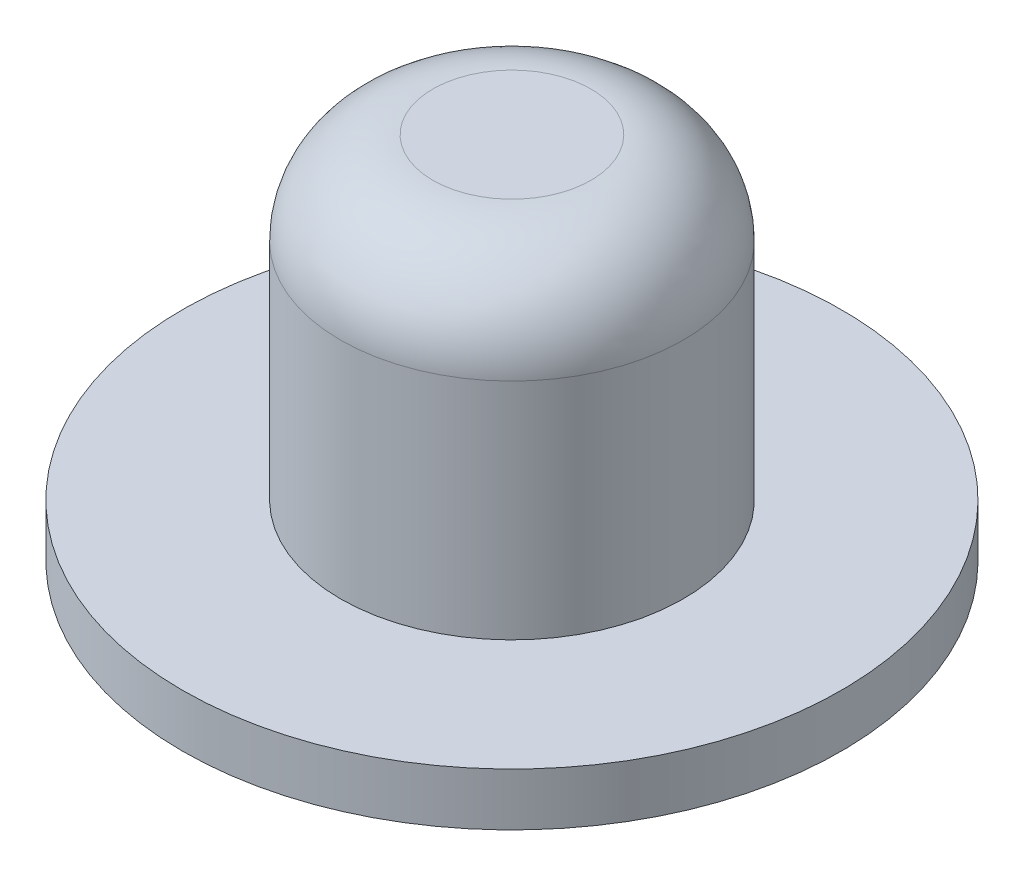
ISO-10303-21;
HEADER;
FILE_DESCRIPTION(('STEP AP214'),'2;1');
FILE_NAME('part.step','',(''),(''),'','','');
FILE_SCHEMA(('AUTOMOTIVE_DESIGN { 1 0 10303 214 1 1 1 1 }'));
ENDSEC;
DATA;
#1=APPLICATION_CONTEXT('core data for automotive mechanical design processes');
#2=APPLICATION_PROTOCOL_DEFINITION('international standard','automotive_design',2000,#1);
#3=PRODUCT_CONTEXT('',#1,'mechanical');
#4=PRODUCT('Part','Part','',(#3));
#5=PRODUCT_RELATED_PRODUCT_CATEGORY('part','',(#4));
#6=PRODUCT_DEFINITION_FORMATION('','',#4);
#7=PRODUCT_DEFINITION_CONTEXT('part definition',#1,'design');
#8=PRODUCT_DEFINITION('design','',#6,#7);
#9=PRODUCT_DEFINITION_SHAPE('','',#8);
#10=(LENGTH_UNIT() NAMED_UNIT(*) SI_UNIT(.MILLI.,.METRE.));
#11=(NAMED_UNIT(*) PLANE_ANGLE_UNIT() SI_UNIT($,.RADIAN.));
#12=(NAMED_UNIT(*) SI_UNIT($,.STERADIAN.) SOLID_ANGLE_UNIT());
#13=UNCERTAINTY_MEASURE_WITH_UNIT(LENGTH_MEASURE(1.E-05),#10,'distance_accuracy_value','');
#14=(GEOMETRIC_REPRESENTATION_CONTEXT(3) GLOBAL_UNCERTAINTY_ASSIGNED_CONTEXT((#13)) GLOBAL_UNIT_ASSIGNED_CONTEXT((#10,
#11,#12)) REPRESENTATION_CONTEXT('',''));
#15=CARTESIAN_POINT('',(0.,0.,0.));
#16=DIRECTION('',(0.,0.,1.));
#17=DIRECTION('',(1.,0.,0.));
#18=AXIS2_PLACEMENT_3D('',#15,#16,#17);
#19=CARTESIAN_POINT('',(0.,2.,0.));
#20=DIRECTION('',(0.,-1.,0.));
#21=DIRECTION('',(0.,0.,-1.));
#22=AXIS2_PLACEMENT_3D('',#19,#20,#21);
#23=CYLINDRICAL_SURFACE('',#22,12.5);
#24=CARTESIAN_POINT('',(0.,2.,0.));
#25=DIRECTION('',(0.,1.,0.));
#26=DIRECTION('',(0.,0.,1.));
#27=AXIS2_PLACEMENT_3D('',#24,#25,#26);
#28=CIRCLE('',#27,12.5);
#29=CARTESIAN_POINT('',(0.,2.,12.5));
#30=VERTEX_POINT('',#29);
#31=EDGE_CURVE('E52',#30,#30,#28,.T.);
#32=ORIENTED_EDGE('',*,*,#31,.F.);
#33=EDGE_LOOP('',(#32));
#34=FACE_BOUND('',#33,.T.);
#35=CARTESIAN_POINT('',(0.,0.,0.));
#36=DIRECTION('',(0.,1.,0.));
#37=DIRECTION('',(0.,0.,1.));
#38=AXIS2_PLACEMENT_3D('',#35,#36,#37);
#39=CIRCLE('',#38,12.5);
#40=CARTESIAN_POINT('',(0.,0.,12.5));
#41=VERTEX_POINT('',#40);
#42=EDGE_CURVE('E55',#41,#41,#39,.T.);
#43=ORIENTED_EDGE('',*,*,#42,.T.);
#44=EDGE_LOOP('',(#43));
#45=FACE_BOUND('',#44,.T.);
#46=ADVANCED_FACE('F37',(#34,#45),#23,.T.);
#47=CARTESIAN_POINT('',(0.,2.,0.));
#48=DIRECTION('',(0.,1.,0.));
#49=DIRECTION('',(0.,0.,1.));
#50=AXIS2_PLACEMENT_3D('',#47,#48,#49);
#51=PLANE('',#50);
#52=CARTESIAN_POINT('',(0.,2.,0.));
#53=DIRECTION('',(0.,1.,0.));
#54=DIRECTION('',(0.,0.,1.));
#55=AXIS2_PLACEMENT_3D('',#52,#53,#54);
#56=CIRCLE('',#55,6.5);
#57=CARTESIAN_POINT('',(0.,2.,6.5));
#58=VERTEX_POINT('',#57);
#59=EDGE_CURVE('E48',#58,#58,#56,.T.);
#60=ORIENTED_EDGE('',*,*,#59,.F.);
#61=EDGE_LOOP('',(#60));
#62=FACE_BOUND('',#61,.T.);
#63=ORIENTED_EDGE('',*,*,#31,.T.);
#64=EDGE_LOOP('',(#63));
#65=FACE_BOUND('',#64,.T.);
#66=ADVANCED_FACE('F61',(#62,#65),#51,.T.);
#67=CARTESIAN_POINT('',(0.,0.,0.));
#68=DIRECTION('',(0.,1.,0.));
#69=DIRECTION('',(0.,0.,1.));
#70=AXIS2_PLACEMENT_3D('',#67,#68,#69);
#71=PLANE('',#70);
#72=ORIENTED_EDGE('',*,*,#42,.F.);
#73=EDGE_LOOP('',(#72));
#74=FACE_BOUND('',#73,.T.);
#75=ADVANCED_FACE('F67',(#74),#71,.F.);
#76=CARTESIAN_POINT('',(0.,14.,0.));
#77=DIRECTION('',(0.,-1.,0.));
#78=DIRECTION('',(0.,0.,-1.));
#79=AXIS2_PLACEMENT_3D('',#76,#77,#78);
#80=CYLINDRICAL_SURFACE('',#79,6.5);
#81=CARTESIAN_POINT('',(0.,10.5,0.));
#82=DIRECTION('',(0.,1.,0.));
#83=DIRECTION('',(0.,0.,1.));
#84=AXIS2_PLACEMENT_3D('',#81,#82,#83);
#85=CIRCLE('',#84,6.5);
#86=CARTESIAN_POINT('',(0.,10.5,6.5));
#87=VERTEX_POINT('',#86);
#88=EDGE_CURVE('E10',#87,#87,#85,.F.);
#89=ORIENTED_EDGE('',*,*,#88,.T.);
#90=EDGE_LOOP('',(#89));
#91=FACE_BOUND('',#90,.T.);
#92=ORIENTED_EDGE('',*,*,#59,.T.);
#93=EDGE_LOOP('',(#92));
#94=FACE_BOUND('',#93,.T.);
#95=ADVANCED_FACE('F69',(#91,#94),#80,.T.);
#96=CARTESIAN_POINT('',(0.,14.,0.));
#97=DIRECTION('',(0.,1.,0.));
#98=DIRECTION('',(0.,0.,1.));
#99=AXIS2_PLACEMENT_3D('',#96,#97,#98);
#100=PLANE('',#99);
#101=CARTESIAN_POINT('',(0.,14.,0.));
#102=DIRECTION('',(0.,1.,0.));
#103=DIRECTION('',(0.,0.,1.));
#104=AXIS2_PLACEMENT_3D('',#101,#102,#103);
#105=CIRCLE('',#104,3.);
#106=CARTESIAN_POINT('',(0.,14.,3.));
#107=VERTEX_POINT('',#106);
#108=EDGE_CURVE('E44',#107,#107,#105,.T.);
#109=ORIENTED_EDGE('',*,*,#108,.T.);
#110=EDGE_LOOP('',(#109));
#111=FACE_BOUND('',#110,.T.);
#112=ADVANCED_FACE('F75',(#111),#100,.T.);
#113=CARTESIAN_POINT('',(0.,10.5,0.));
#114=DIRECTION('',(0.,1.,0.));
#115=DIRECTION('',(0.,0.,1.));
#116=AXIS2_PLACEMENT_3D('',#113,#114,#115);
#117=DEGENERATE_TOROIDAL_SURFACE('',#116,3.,3.5,.T.);
#118=ORIENTED_EDGE('',*,*,#88,.F.);
#119=EDGE_LOOP('',(#118));
#120=FACE_BOUND('',#119,.T.);
#121=ORIENTED_EDGE('',*,*,#108,.F.);
#122=EDGE_LOOP('',(#121));
#123=FACE_BOUND('',#122,.T.);
#124=ADVANCED_FACE('F39',(#120,#123),#117,.T.);
#125=CLOSED_SHELL('',(#46,#66,#75,#95,#112,#124));
#126=MANIFOLD_SOLID_BREP('B2',#125);
#127=ADVANCED_BREP_SHAPE_REPRESENTATION('',(#18,#126),#14);
#128=SHAPE_DEFINITION_REPRESENTATION(#9,#127);
ENDSEC;
END-ISO-10303-21;
